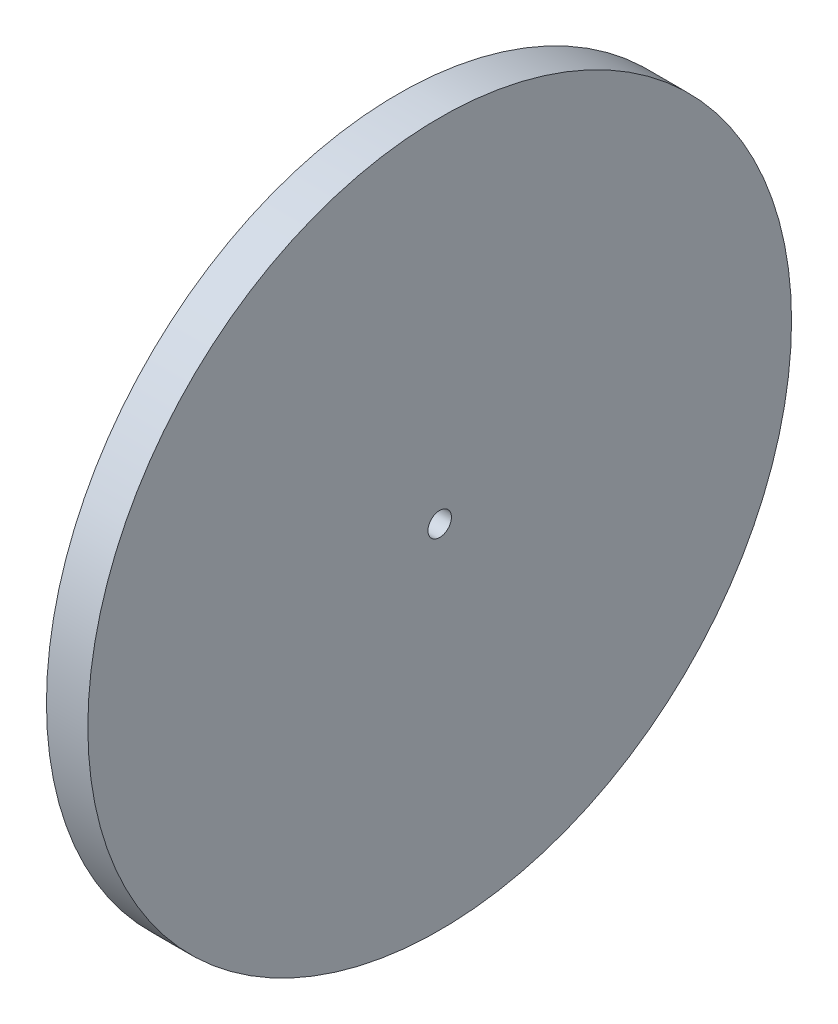
ISO-10303-21;
HEADER;
FILE_DESCRIPTION(('STEP AP214'),'2;1');
FILE_NAME('part.step','',(''),(''),'','','');
FILE_SCHEMA(('AUTOMOTIVE_DESIGN { 1 0 10303 214 1 1 1 1 }'));
ENDSEC;
DATA;
#1=APPLICATION_CONTEXT('core data for automotive mechanical design processes');
#2=APPLICATION_PROTOCOL_DEFINITION('international standard','automotive_design',2000,#1);
#3=PRODUCT_CONTEXT('',#1,'mechanical');
#4=PRODUCT('Part','Part','',(#3));
#5=PRODUCT_RELATED_PRODUCT_CATEGORY('part','',(#4));
#6=PRODUCT_DEFINITION_FORMATION('','',#4);
#7=PRODUCT_DEFINITION_CONTEXT('part definition',#1,'design');
#8=PRODUCT_DEFINITION('design','',#6,#7);
#9=PRODUCT_DEFINITION_SHAPE('','',#8);
#10=(LENGTH_UNIT() NAMED_UNIT(*) SI_UNIT(.MILLI.,.METRE.));
#11=(NAMED_UNIT(*) PLANE_ANGLE_UNIT() SI_UNIT($,.RADIAN.));
#12=(NAMED_UNIT(*) SI_UNIT($,.STERADIAN.) SOLID_ANGLE_UNIT());
#13=UNCERTAINTY_MEASURE_WITH_UNIT(LENGTH_MEASURE(1.E-05),#10,'distance_accuracy_value','');
#14=(GEOMETRIC_REPRESENTATION_CONTEXT(3) GLOBAL_UNCERTAINTY_ASSIGNED_CONTEXT((#13)) GLOBAL_UNIT_ASSIGNED_CONTEXT((#10,
#11,#12)) REPRESENTATION_CONTEXT('',''));
#15=CARTESIAN_POINT('',(0.,0.,0.));
#16=DIRECTION('',(0.,0.,1.));
#17=DIRECTION('',(1.,0.,0.));
#18=AXIS2_PLACEMENT_3D('',#15,#16,#17);
#19=CARTESIAN_POINT('',(3.175,2.663866039953,1.77591069330199));
#20=DIRECTION('',(1.,0.,0.));
#21=DIRECTION('',(0.,0.,-1.));
#22=AXIS2_PLACEMENT_3D('',#19,#20,#21);
#23=PLANE('',#22);
#24=CARTESIAN_POINT('',(3.175,2.663866039953,1.77591069330199));
#25=DIRECTION('',(1.,0.,0.));
#26=DIRECTION('',(0.,0.,-1.));
#27=AXIS2_PLACEMENT_3D('',#24,#25,#26);
#28=CIRCLE('',#27,27.);
#29=CARTESIAN_POINT('',(3.175,2.663866039953,-25.224089306698));
#30=VERTEX_POINT('',#29);
#31=EDGE_CURVE('E10',#30,#30,#28,.T.);
#32=ORIENTED_EDGE('',*,*,#31,.T.);
#33=EDGE_LOOP('',(#32));
#34=FACE_BOUND('',#33,.T.);
#35=CARTESIAN_POINT('',(3.175,2.663866039953,1.77591069330199));
#36=DIRECTION('',(1.,0.,0.));
#37=DIRECTION('',(0.,0.,-1.));
#38=AXIS2_PLACEMENT_3D('',#35,#36,#37);
#39=CIRCLE('',#38,0.9);
#40=CARTESIAN_POINT('',(3.175,2.663866039953,0.875910693301991));
#41=VERTEX_POINT('',#40);
#42=EDGE_CURVE('E40',#41,#41,#39,.T.);
#43=ORIENTED_EDGE('',*,*,#42,.F.);
#44=EDGE_LOOP('',(#43));
#45=FACE_BOUND('',#44,.T.);
#46=ADVANCED_FACE('F29',(#34,#45),#23,.T.);
#47=CARTESIAN_POINT('',(0.,2.663866039953,1.77591069330199));
#48=DIRECTION('',(1.,0.,0.));
#49=DIRECTION('',(0.,0.,-1.));
#50=AXIS2_PLACEMENT_3D('',#47,#48,#49);
#51=PLANE('',#50);
#52=CARTESIAN_POINT('',(0.,2.663866039953,1.77591069330199));
#53=DIRECTION('',(1.,0.,0.));
#54=DIRECTION('',(0.,0.,-1.));
#55=AXIS2_PLACEMENT_3D('',#52,#53,#54);
#56=CIRCLE('',#55,27.);
#57=CARTESIAN_POINT('',(0.,2.663866039953,-25.224089306698));
#58=VERTEX_POINT('',#57);
#59=EDGE_CURVE('E33',#58,#58,#56,.T.);
#60=ORIENTED_EDGE('',*,*,#59,.F.);
#61=EDGE_LOOP('',(#60));
#62=FACE_BOUND('',#61,.T.);
#63=CARTESIAN_POINT('',(0.,2.663866039953,1.77591069330199));
#64=DIRECTION('',(1.,0.,0.));
#65=DIRECTION('',(0.,0.,-1.));
#66=AXIS2_PLACEMENT_3D('',#63,#64,#65);
#67=CIRCLE('',#66,0.9);
#68=CARTESIAN_POINT('',(0.,2.663866039953,0.875910693301991));
#69=VERTEX_POINT('',#68);
#70=EDGE_CURVE('E42',#69,#69,#67,.T.);
#71=ORIENTED_EDGE('',*,*,#70,.T.);
#72=EDGE_LOOP('',(#71));
#73=FACE_BOUND('',#72,.T.);
#74=ADVANCED_FACE('F52',(#62,#73),#51,.F.);
#75=CARTESIAN_POINT('',(3.175,2.663866039953,1.77591069330199));
#76=DIRECTION('',(-1.,0.,0.));
#77=DIRECTION('',(0.,0.,1.));
#78=AXIS2_PLACEMENT_3D('',#75,#76,#77);
#79=CYLINDRICAL_SURFACE('',#78,27.);
#80=ORIENTED_EDGE('',*,*,#31,.F.);
#81=EDGE_LOOP('',(#80));
#82=FACE_BOUND('',#81,.T.);
#83=ORIENTED_EDGE('',*,*,#59,.T.);
#84=EDGE_LOOP('',(#83));
#85=FACE_BOUND('',#84,.T.);
#86=ADVANCED_FACE('F31',(#82,#85),#79,.T.);
#87=CARTESIAN_POINT('',(3.175,2.663866039953,1.77591069330199));
#88=DIRECTION('',(-1.,0.,0.));
#89=DIRECTION('',(0.,0.,1.));
#90=AXIS2_PLACEMENT_3D('',#87,#88,#89);
#91=CYLINDRICAL_SURFACE('',#90,0.9);
#92=ORIENTED_EDGE('',*,*,#42,.T.);
#93=EDGE_LOOP('',(#92));
#94=FACE_BOUND('',#93,.T.);
#95=ORIENTED_EDGE('',*,*,#70,.F.);
#96=EDGE_LOOP('',(#95));
#97=FACE_BOUND('',#96,.T.);
#98=ADVANCED_FACE('F48',(#94,#97),#91,.F.);
#99=CLOSED_SHELL('',(#46,#74,#86,#98));
#100=MANIFOLD_SOLID_BREP('B2',#99);
#101=ADVANCED_BREP_SHAPE_REPRESENTATION('',(#18,#100),#14);
#102=SHAPE_DEFINITION_REPRESENTATION(#9,#101);
ENDSEC;
END-ISO-10303-21;
